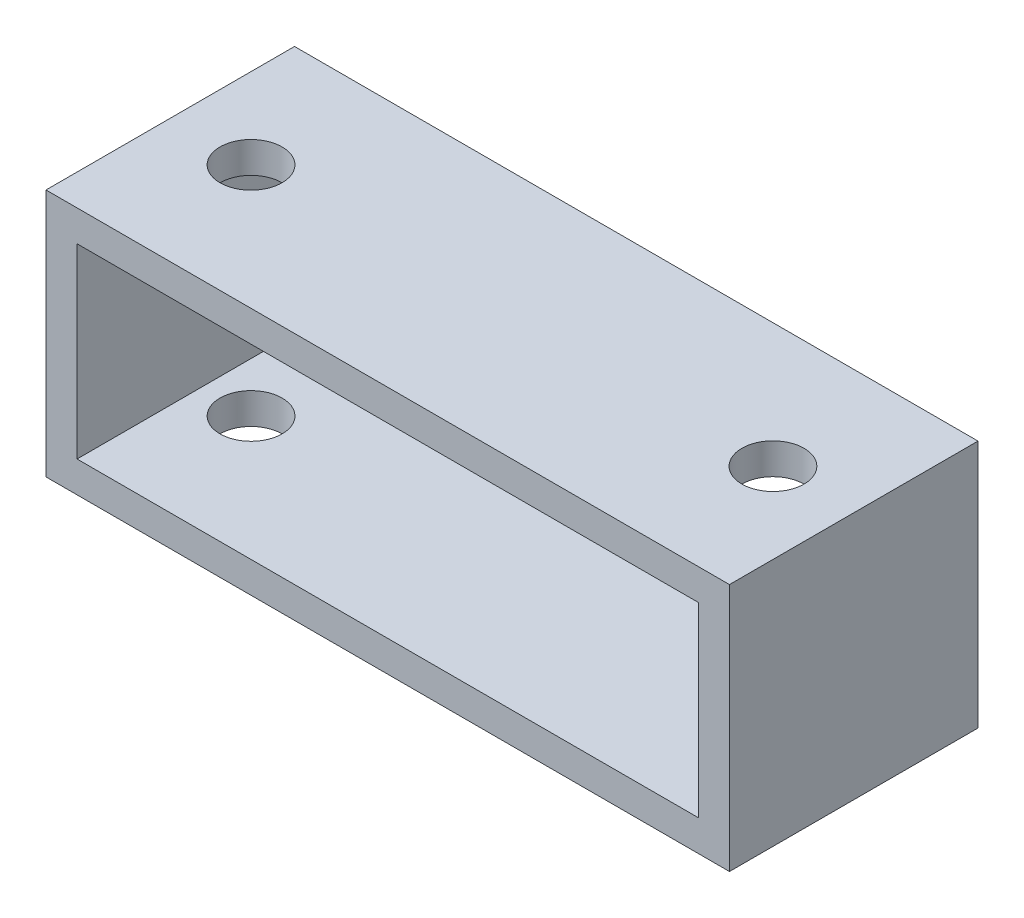
ISO-10303-21;
HEADER;
FILE_DESCRIPTION(('STEP AP214'),'2;1');
FILE_NAME('part.step','',(''),(''),'','','');
FILE_SCHEMA(('AUTOMOTIVE_DESIGN { 1 0 10303 214 1 1 1 1 }'));
ENDSEC;
DATA;
#1=APPLICATION_CONTEXT('core data for automotive mechanical design processes');
#2=APPLICATION_PROTOCOL_DEFINITION('international standard','automotive_design',2000,#1);
#3=PRODUCT_CONTEXT('',#1,'mechanical');
#4=PRODUCT('Part','Part','',(#3));
#5=PRODUCT_RELATED_PRODUCT_CATEGORY('part','',(#4));
#6=PRODUCT_DEFINITION_FORMATION('','',#4);
#7=PRODUCT_DEFINITION_CONTEXT('part definition',#1,'design');
#8=PRODUCT_DEFINITION('design','',#6,#7);
#9=PRODUCT_DEFINITION_SHAPE('','',#8);
#10=(LENGTH_UNIT() NAMED_UNIT(*) SI_UNIT(.MILLI.,.METRE.));
#11=(NAMED_UNIT(*) PLANE_ANGLE_UNIT() SI_UNIT($,.RADIAN.));
#12=(NAMED_UNIT(*) SI_UNIT($,.STERADIAN.) SOLID_ANGLE_UNIT());
#13=UNCERTAINTY_MEASURE_WITH_UNIT(LENGTH_MEASURE(1.E-05),#10,'distance_accuracy_value','');
#14=(GEOMETRIC_REPRESENTATION_CONTEXT(3) GLOBAL_UNCERTAINTY_ASSIGNED_CONTEXT((#13)) GLOBAL_UNIT_ASSIGNED_CONTEXT((#10,
#11,#12)) REPRESENTATION_CONTEXT('',''));
#15=CARTESIAN_POINT('',(0.,0.,0.));
#16=DIRECTION('',(0.,0.,1.));
#17=DIRECTION('',(1.,0.,0.));
#18=AXIS2_PLACEMENT_3D('',#15,#16,#17);
#19=CARTESIAN_POINT('',(27.5,20.,10.));
#20=DIRECTION('',(-1.,0.,0.));
#21=DIRECTION('',(0.,0.,1.));
#22=AXIS2_PLACEMENT_3D('',#19,#20,#21);
#23=PLANE('',#22);
#24=DIRECTION('',(0.,0.,-1.));
#25=VECTOR('',#24,1.);
#26=CARTESIAN_POINT('',(27.5,0.,10.));
#27=LINE('',#26,#25);
#28=CARTESIAN_POINT('',(27.5,0.,10.));
#29=VERTEX_POINT('',#28);
#30=CARTESIAN_POINT('',(27.5,0.,-10.));
#31=VERTEX_POINT('',#30);
#32=EDGE_CURVE('E119',#29,#31,#27,.T.);
#33=ORIENTED_EDGE('',*,*,#32,.T.);
#34=DIRECTION('',(0.,-1.,0.));
#35=VECTOR('',#34,1.);
#36=CARTESIAN_POINT('',(27.5,20.,-10.));
#37=LINE('',#36,#35);
#38=CARTESIAN_POINT('',(27.5,20.,-10.));
#39=VERTEX_POINT('',#38);
#40=EDGE_CURVE('E11',#39,#31,#37,.T.);
#41=ORIENTED_EDGE('',*,*,#40,.F.);
#42=DIRECTION('',(0.,0.,-1.));
#43=VECTOR('',#42,1.);
#44=CARTESIAN_POINT('',(27.5,20.,10.));
#45=LINE('',#44,#43);
#46=CARTESIAN_POINT('',(27.5,20.,10.));
#47=VERTEX_POINT('',#46);
#48=EDGE_CURVE('E142',#47,#39,#45,.T.);
#49=ORIENTED_EDGE('',*,*,#48,.F.);
#50=DIRECTION('',(0.,-1.,0.));
#51=VECTOR('',#50,1.);
#52=CARTESIAN_POINT('',(27.5,20.,10.));
#53=LINE('',#52,#51);
#54=EDGE_CURVE('E152',#47,#29,#53,.T.);
#55=ORIENTED_EDGE('',*,*,#54,.T.);
#56=EDGE_LOOP('',(#33,#41,#49,#55));
#57=FACE_BOUND('',#56,.T.);
#58=ADVANCED_FACE('F39',(#57),#23,.F.);
#59=CARTESIAN_POINT('',(-27.5,20.,-10.));
#60=DIRECTION('',(0.,0.,1.));
#61=DIRECTION('',(1.,0.,0.));
#62=AXIS2_PLACEMENT_3D('',#59,#60,#61);
#63=PLANE('',#62);
#64=DIRECTION('',(-1.,0.,0.));
#65=VECTOR('',#64,1.);
#66=CARTESIAN_POINT('',(-25.,2.5,-10.));
#67=LINE('',#66,#65);
#68=CARTESIAN_POINT('',(25.,2.5,-10.));
#69=VERTEX_POINT('',#68);
#70=CARTESIAN_POINT('',(-25.,2.5,-10.));
#71=VERTEX_POINT('',#70);
#72=EDGE_CURVE('E125',#69,#71,#67,.T.);
#73=ORIENTED_EDGE('',*,*,#72,.F.);
#74=DIRECTION('',(0.,-1.,0.));
#75=VECTOR('',#74,1.);
#76=CARTESIAN_POINT('',(25.,2.5,-10.));
#77=LINE('',#76,#75);
#78=CARTESIAN_POINT('',(25.,17.5,-10.));
#79=VERTEX_POINT('',#78);
#80=EDGE_CURVE('E107',#79,#69,#77,.T.);
#81=ORIENTED_EDGE('',*,*,#80,.F.);
#82=DIRECTION('',(1.,0.,0.));
#83=VECTOR('',#82,1.);
#84=CARTESIAN_POINT('',(-25.,17.5,-10.));
#85=LINE('',#84,#83);
#86=CARTESIAN_POINT('',(-25.,17.5,-10.));
#87=VERTEX_POINT('',#86);
#88=EDGE_CURVE('E116',#87,#79,#85,.T.);
#89=ORIENTED_EDGE('',*,*,#88,.F.);
#90=DIRECTION('',(0.,1.,0.));
#91=VECTOR('',#90,1.);
#92=CARTESIAN_POINT('',(-25.,2.5,-10.));
#93=LINE('',#92,#91);
#94=EDGE_CURVE('E55',#71,#87,#93,.T.);
#95=ORIENTED_EDGE('',*,*,#94,.F.);
#96=EDGE_LOOP('',(#73,#81,#89,#95));
#97=FACE_BOUND('',#96,.T.);
#98=DIRECTION('',(-1.,0.,0.));
#99=VECTOR('',#98,1.);
#100=CARTESIAN_POINT('',(-27.5,0.,-10.));
#101=LINE('',#100,#99);
#102=CARTESIAN_POINT('',(-27.5,0.,-10.));
#103=VERTEX_POINT('',#102);
#104=EDGE_CURVE('E155',#31,#103,#101,.T.);
#105=ORIENTED_EDGE('',*,*,#104,.T.);
#106=DIRECTION('',(0.,-1.,0.));
#107=VECTOR('',#106,1.);
#108=CARTESIAN_POINT('',(-27.5,20.,-10.));
#109=LINE('',#108,#107);
#110=CARTESIAN_POINT('',(-27.5,20.,-10.));
#111=VERTEX_POINT('',#110);
#112=EDGE_CURVE('E47',#111,#103,#109,.T.);
#113=ORIENTED_EDGE('',*,*,#112,.F.);
#114=DIRECTION('',(-1.,0.,0.));
#115=VECTOR('',#114,1.);
#116=CARTESIAN_POINT('',(-27.5,20.,-10.));
#117=LINE('',#116,#115);
#118=EDGE_CURVE('E145',#39,#111,#117,.T.);
#119=ORIENTED_EDGE('',*,*,#118,.F.);
#120=ORIENTED_EDGE('',*,*,#40,.T.);
#121=EDGE_LOOP('',(#105,#113,#119,#120));
#122=FACE_BOUND('',#121,.T.);
#123=ADVANCED_FACE('F122',(#97,#122),#63,.F.);
#124=CARTESIAN_POINT('',(-27.5,20.,10.));
#125=DIRECTION('',(1.,0.,0.));
#126=DIRECTION('',(0.,0.,-1.));
#127=AXIS2_PLACEMENT_3D('',#124,#125,#126);
#128=PLANE('',#127);
#129=DIRECTION('',(0.,0.,1.));
#130=VECTOR('',#129,1.);
#131=CARTESIAN_POINT('',(-27.5,0.,10.));
#132=LINE('',#131,#130);
#133=CARTESIAN_POINT('',(-27.5,0.,10.));
#134=VERTEX_POINT('',#133);
#135=EDGE_CURVE('E157',#103,#134,#132,.T.);
#136=ORIENTED_EDGE('',*,*,#135,.T.);
#137=DIRECTION('',(0.,-1.,0.));
#138=VECTOR('',#137,1.);
#139=CARTESIAN_POINT('',(-27.5,20.,10.));
#140=LINE('',#139,#138);
#141=CARTESIAN_POINT('',(-27.5,20.,10.));
#142=VERTEX_POINT('',#141);
#143=EDGE_CURVE('E162',#142,#134,#140,.T.);
#144=ORIENTED_EDGE('',*,*,#143,.F.);
#145=DIRECTION('',(0.,0.,1.));
#146=VECTOR('',#145,1.);
#147=CARTESIAN_POINT('',(-27.5,20.,10.));
#148=LINE('',#147,#146);
#149=EDGE_CURVE('E148',#111,#142,#148,.T.);
#150=ORIENTED_EDGE('',*,*,#149,.F.);
#151=ORIENTED_EDGE('',*,*,#112,.T.);
#152=EDGE_LOOP('',(#136,#144,#150,#151));
#153=FACE_BOUND('',#152,.T.);
#154=ADVANCED_FACE('F217',(#153),#128,.F.);
#155=CARTESIAN_POINT('',(-27.5,20.,10.));
#156=DIRECTION('',(0.,0.,-1.));
#157=DIRECTION('',(-1.,0.,0.));
#158=AXIS2_PLACEMENT_3D('',#155,#156,#157);
#159=PLANE('',#158);
#160=DIRECTION('',(-1.,0.,0.));
#161=VECTOR('',#160,1.);
#162=CARTESIAN_POINT('',(-25.,17.5,10.));
#163=LINE('',#162,#161);
#164=CARTESIAN_POINT('',(25.,17.5,10.));
#165=VERTEX_POINT('',#164);
#166=CARTESIAN_POINT('',(-25.,17.5,10.));
#167=VERTEX_POINT('',#166);
#168=EDGE_CURVE('E127',#165,#167,#163,.T.);
#169=ORIENTED_EDGE('',*,*,#168,.F.);
#170=DIRECTION('',(0.,1.,0.));
#171=VECTOR('',#170,1.);
#172=CARTESIAN_POINT('',(25.,2.5,10.));
#173=LINE('',#172,#171);
#174=CARTESIAN_POINT('',(25.,2.5,10.));
#175=VERTEX_POINT('',#174);
#176=EDGE_CURVE('E63',#175,#165,#173,.T.);
#177=ORIENTED_EDGE('',*,*,#176,.F.);
#178=DIRECTION('',(1.,0.,0.));
#179=VECTOR('',#178,1.);
#180=CARTESIAN_POINT('',(-25.,2.5,10.));
#181=LINE('',#180,#179);
#182=CARTESIAN_POINT('',(-25.,2.5,10.));
#183=VERTEX_POINT('',#182);
#184=EDGE_CURVE('E113',#183,#175,#181,.T.);
#185=ORIENTED_EDGE('',*,*,#184,.F.);
#186=DIRECTION('',(0.,-1.,0.));
#187=VECTOR('',#186,1.);
#188=CARTESIAN_POINT('',(-25.,2.5,10.));
#189=LINE('',#188,#187);
#190=EDGE_CURVE('E133',#167,#183,#189,.T.);
#191=ORIENTED_EDGE('',*,*,#190,.F.);
#192=EDGE_LOOP('',(#169,#177,#185,#191));
#193=FACE_BOUND('',#192,.T.);
#194=DIRECTION('',(1.,0.,0.));
#195=VECTOR('',#194,1.);
#196=CARTESIAN_POINT('',(-27.5,0.,10.));
#197=LINE('',#196,#195);
#198=EDGE_CURVE('E146',#134,#29,#197,.T.);
#199=ORIENTED_EDGE('',*,*,#198,.T.);
#200=ORIENTED_EDGE('',*,*,#54,.F.);
#201=DIRECTION('',(1.,0.,0.));
#202=VECTOR('',#201,1.);
#203=CARTESIAN_POINT('',(-27.5,20.,10.));
#204=LINE('',#203,#202);
#205=EDGE_CURVE('E150',#142,#47,#204,.T.);
#206=ORIENTED_EDGE('',*,*,#205,.F.);
#207=ORIENTED_EDGE('',*,*,#143,.T.);
#208=EDGE_LOOP('',(#199,#200,#206,#207));
#209=FACE_BOUND('',#208,.T.);
#210=ADVANCED_FACE('F233',(#193,#209),#159,.F.);
#211=CARTESIAN_POINT('',(0.,20.,0.));
#212=DIRECTION('',(0.,-1.,0.));
#213=DIRECTION('',(0.,0.,-1.));
#214=AXIS2_PLACEMENT_3D('',#211,#212,#213);
#215=PLANE('',#214);
#216=CARTESIAN_POINT('',(-21.,20.,0.));
#217=DIRECTION('',(0.,1.,0.));
#218=DIRECTION('',(0.,0.,1.));
#219=AXIS2_PLACEMENT_3D('',#216,#217,#218);
#220=CIRCLE('',#219,2.5);
#221=CARTESIAN_POINT('',(-21.,20.,2.5));
#222=VERTEX_POINT('',#221);
#223=EDGE_CURVE('E175',#222,#222,#220,.T.);
#224=ORIENTED_EDGE('',*,*,#223,.F.);
#225=EDGE_LOOP('',(#224));
#226=FACE_BOUND('',#225,.T.);
#227=CARTESIAN_POINT('',(21.,20.,0.));
#228=DIRECTION('',(0.,1.,0.));
#229=DIRECTION('',(0.,0.,1.));
#230=AXIS2_PLACEMENT_3D('',#227,#228,#229);
#231=CIRCLE('',#230,2.5);
#232=CARTESIAN_POINT('',(21.,20.,2.5));
#233=VERTEX_POINT('',#232);
#234=EDGE_CURVE('E180',#233,#233,#231,.T.);
#235=ORIENTED_EDGE('',*,*,#234,.F.);
#236=EDGE_LOOP('',(#235));
#237=FACE_BOUND('',#236,.T.);
#238=ORIENTED_EDGE('',*,*,#48,.T.);
#239=ORIENTED_EDGE('',*,*,#118,.T.);
#240=ORIENTED_EDGE('',*,*,#149,.T.);
#241=ORIENTED_EDGE('',*,*,#205,.T.);
#242=EDGE_LOOP('',(#238,#239,#240,#241));
#243=FACE_BOUND('',#242,.T.);
#244=ADVANCED_FACE('F229',(#226,#237,#243),#215,.F.);
#245=CARTESIAN_POINT('',(0.,0.,0.));
#246=DIRECTION('',(0.,-1.,0.));
#247=DIRECTION('',(0.,0.,-1.));
#248=AXIS2_PLACEMENT_3D('',#245,#246,#247);
#249=PLANE('',#248);
#250=CARTESIAN_POINT('',(-21.,0.,0.));
#251=DIRECTION('',(0.,-1.,0.));
#252=DIRECTION('',(0.,0.,-1.));
#253=AXIS2_PLACEMENT_3D('',#250,#251,#252);
#254=CIRCLE('',#253,2.5);
#255=CARTESIAN_POINT('',(-21.,0.,-2.5));
#256=VERTEX_POINT('',#255);
#257=EDGE_CURVE('E169',#256,#256,#254,.F.);
#258=ORIENTED_EDGE('',*,*,#257,.T.);
#259=EDGE_LOOP('',(#258));
#260=FACE_BOUND('',#259,.T.);
#261=CARTESIAN_POINT('',(21.,0.,0.));
#262=DIRECTION('',(0.,-1.,0.));
#263=DIRECTION('',(0.,0.,-1.));
#264=AXIS2_PLACEMENT_3D('',#261,#262,#263);
#265=CIRCLE('',#264,2.5);
#266=CARTESIAN_POINT('',(21.,0.,-2.5));
#267=VERTEX_POINT('',#266);
#268=EDGE_CURVE('E183',#267,#267,#265,.F.);
#269=ORIENTED_EDGE('',*,*,#268,.T.);
#270=EDGE_LOOP('',(#269));
#271=FACE_BOUND('',#270,.T.);
#272=ORIENTED_EDGE('',*,*,#32,.F.);
#273=ORIENTED_EDGE('',*,*,#198,.F.);
#274=ORIENTED_EDGE('',*,*,#135,.F.);
#275=ORIENTED_EDGE('',*,*,#104,.F.);
#276=EDGE_LOOP('',(#272,#273,#274,#275));
#277=FACE_BOUND('',#276,.T.);
#278=ADVANCED_FACE('F224',(#260,#271,#277),#249,.T.);
#279=CARTESIAN_POINT('',(25.,2.5,-10.001));
#280=DIRECTION('',(1.,0.,0.));
#281=DIRECTION('',(0.,0.,-1.));
#282=AXIS2_PLACEMENT_3D('',#279,#280,#281);
#283=PLANE('',#282);
#284=ORIENTED_EDGE('',*,*,#80,.T.);
#285=DIRECTION('',(0.,0.,1.));
#286=VECTOR('',#285,1.);
#287=CARTESIAN_POINT('',(25.,2.5,-10.001));
#288=LINE('',#287,#286);
#289=EDGE_CURVE('E120',#69,#175,#288,.T.);
#290=ORIENTED_EDGE('',*,*,#289,.T.);
#291=ORIENTED_EDGE('',*,*,#176,.T.);
#292=DIRECTION('',(0.,0.,1.));
#293=VECTOR('',#292,1.);
#294=CARTESIAN_POINT('',(25.,17.5,-10.001));
#295=LINE('',#294,#293);
#296=EDGE_CURVE('E103',#79,#165,#295,.T.);
#297=ORIENTED_EDGE('',*,*,#296,.F.);
#298=EDGE_LOOP('',(#284,#290,#291,#297));
#299=FACE_BOUND('',#298,.T.);
#300=ADVANCED_FACE('F105',(#299),#283,.F.);
#301=CARTESIAN_POINT('',(-25.,2.5,-10.001));
#302=DIRECTION('',(0.,-1.,0.));
#303=DIRECTION('',(0.,0.,-1.));
#304=AXIS2_PLACEMENT_3D('',#301,#302,#303);
#305=PLANE('',#304);
#306=CARTESIAN_POINT('',(-21.,2.5,0.));
#307=DIRECTION('',(0.,-1.,0.));
#308=DIRECTION('',(0.,0.,-1.));
#309=AXIS2_PLACEMENT_3D('',#306,#307,#308);
#310=CIRCLE('',#309,2.5);
#311=CARTESIAN_POINT('',(-21.,2.5,-2.5));
#312=VERTEX_POINT('',#311);
#313=EDGE_CURVE('E188',#312,#312,#310,.T.);
#314=ORIENTED_EDGE('',*,*,#313,.T.);
#315=EDGE_LOOP('',(#314));
#316=FACE_BOUND('',#315,.T.);
#317=CARTESIAN_POINT('',(21.,2.5,0.));
#318=DIRECTION('',(0.,-1.,0.));
#319=DIRECTION('',(0.,0.,-1.));
#320=AXIS2_PLACEMENT_3D('',#317,#318,#319);
#321=CIRCLE('',#320,2.5);
#322=CARTESIAN_POINT('',(21.,2.5,-2.5));
#323=VERTEX_POINT('',#322);
#324=EDGE_CURVE('E168',#323,#323,#321,.T.);
#325=ORIENTED_EDGE('',*,*,#324,.T.);
#326=EDGE_LOOP('',(#325));
#327=FACE_BOUND('',#326,.T.);
#328=ORIENTED_EDGE('',*,*,#72,.T.);
#329=DIRECTION('',(0.,0.,1.));
#330=VECTOR('',#329,1.);
#331=CARTESIAN_POINT('',(-25.,2.5,-10.001));
#332=LINE('',#331,#330);
#333=EDGE_CURVE('E139',#71,#183,#332,.T.);
#334=ORIENTED_EDGE('',*,*,#333,.T.);
#335=ORIENTED_EDGE('',*,*,#184,.T.);
#336=ORIENTED_EDGE('',*,*,#289,.F.);
#337=EDGE_LOOP('',(#328,#334,#335,#336));
#338=FACE_BOUND('',#337,.T.);
#339=ADVANCED_FACE('F250',(#316,#327,#338),#305,.F.);
#340=CARTESIAN_POINT('',(-25.,2.5,-10.001));
#341=DIRECTION('',(-1.,0.,0.));
#342=DIRECTION('',(0.,0.,1.));
#343=AXIS2_PLACEMENT_3D('',#340,#341,#342);
#344=PLANE('',#343);
#345=ORIENTED_EDGE('',*,*,#94,.T.);
#346=DIRECTION('',(0.,0.,1.));
#347=VECTOR('',#346,1.);
#348=CARTESIAN_POINT('',(-25.,17.5,-10.001));
#349=LINE('',#348,#347);
#350=EDGE_CURVE('E112',#87,#167,#349,.T.);
#351=ORIENTED_EDGE('',*,*,#350,.T.);
#352=ORIENTED_EDGE('',*,*,#190,.T.);
#353=ORIENTED_EDGE('',*,*,#333,.F.);
#354=EDGE_LOOP('',(#345,#351,#352,#353));
#355=FACE_BOUND('',#354,.T.);
#356=ADVANCED_FACE('F253',(#355),#344,.F.);
#357=CARTESIAN_POINT('',(-25.,17.5,-10.001));
#358=DIRECTION('',(0.,1.,0.));
#359=DIRECTION('',(0.,0.,1.));
#360=AXIS2_PLACEMENT_3D('',#357,#358,#359);
#361=PLANE('',#360);
#362=CARTESIAN_POINT('',(-21.,17.5,0.));
#363=DIRECTION('',(0.,1.,0.));
#364=DIRECTION('',(0.,0.,1.));
#365=AXIS2_PLACEMENT_3D('',#362,#363,#364);
#366=CIRCLE('',#365,2.5);
#367=CARTESIAN_POINT('',(-21.,17.5,2.5));
#368=VERTEX_POINT('',#367);
#369=EDGE_CURVE('E42',#368,#368,#366,.T.);
#370=ORIENTED_EDGE('',*,*,#369,.T.);
#371=EDGE_LOOP('',(#370));
#372=FACE_BOUND('',#371,.T.);
#373=CARTESIAN_POINT('',(21.,17.5,0.));
#374=DIRECTION('',(0.,1.,0.));
#375=DIRECTION('',(0.,0.,1.));
#376=AXIS2_PLACEMENT_3D('',#373,#374,#375);
#377=CIRCLE('',#376,2.5);
#378=CARTESIAN_POINT('',(21.,17.5,2.5));
#379=VERTEX_POINT('',#378);
#380=EDGE_CURVE('E166',#379,#379,#377,.T.);
#381=ORIENTED_EDGE('',*,*,#380,.T.);
#382=EDGE_LOOP('',(#381));
#383=FACE_BOUND('',#382,.T.);
#384=ORIENTED_EDGE('',*,*,#88,.T.);
#385=ORIENTED_EDGE('',*,*,#296,.T.);
#386=ORIENTED_EDGE('',*,*,#168,.T.);
#387=ORIENTED_EDGE('',*,*,#350,.F.);
#388=EDGE_LOOP('',(#384,#385,#386,#387));
#389=FACE_BOUND('',#388,.T.);
#390=ADVANCED_FACE('F117',(#372,#383,#389),#361,.F.);
#391=CARTESIAN_POINT('',(21.,-7.07106781186547,0.));
#392=DIRECTION('',(0.,1.,0.));
#393=DIRECTION('',(0.,0.,1.));
#394=AXIS2_PLACEMENT_3D('',#391,#392,#393);
#395=CYLINDRICAL_SURFACE('',#394,2.5);
#396=ORIENTED_EDGE('',*,*,#234,.T.);
#397=EDGE_LOOP('',(#396));
#398=FACE_BOUND('',#397,.T.);
#399=ORIENTED_EDGE('',*,*,#380,.F.);
#400=EDGE_LOOP('',(#399));
#401=FACE_BOUND('',#400,.T.);
#402=ADVANCED_FACE('F199',(#398,#401),#395,.F.);
#403=CARTESIAN_POINT('',(-21.,-7.07106781186547,0.));
#404=DIRECTION('',(0.,1.,0.));
#405=DIRECTION('',(0.,0.,1.));
#406=AXIS2_PLACEMENT_3D('',#403,#404,#405);
#407=CYLINDRICAL_SURFACE('',#406,2.5);
#408=ORIENTED_EDGE('',*,*,#223,.T.);
#409=EDGE_LOOP('',(#408));
#410=FACE_BOUND('',#409,.T.);
#411=ORIENTED_EDGE('',*,*,#369,.F.);
#412=EDGE_LOOP('',(#411));
#413=FACE_BOUND('',#412,.T.);
#414=ADVANCED_FACE('F196',(#410,#413),#407,.F.);
#415=ORIENTED_EDGE('',*,*,#268,.F.);
#416=EDGE_LOOP('',(#415));
#417=FACE_BOUND('',#416,.T.);
#418=ORIENTED_EDGE('',*,*,#324,.F.);
#419=EDGE_LOOP('',(#418));
#420=FACE_BOUND('',#419,.T.);
#421=ADVANCED_FACE('F198',(#417,#420),#395,.F.);
#422=ORIENTED_EDGE('',*,*,#257,.F.);
#423=EDGE_LOOP('',(#422));
#424=FACE_BOUND('',#423,.T.);
#425=ORIENTED_EDGE('',*,*,#313,.F.);
#426=EDGE_LOOP('',(#425));
#427=FACE_BOUND('',#426,.T.);
#428=ADVANCED_FACE('F202',(#424,#427),#407,.F.);
#429=CLOSED_SHELL('',(#58,#123,#154,#210,#244,#278,#300,#339,#356,#390,#402,#414,#421,#428));
#430=MANIFOLD_SOLID_BREP('B2',#429);
#431=ADVANCED_BREP_SHAPE_REPRESENTATION('',(#18,#430),#14);
#432=SHAPE_DEFINITION_REPRESENTATION(#9,#431);
ENDSEC;
END-ISO-10303-21;
